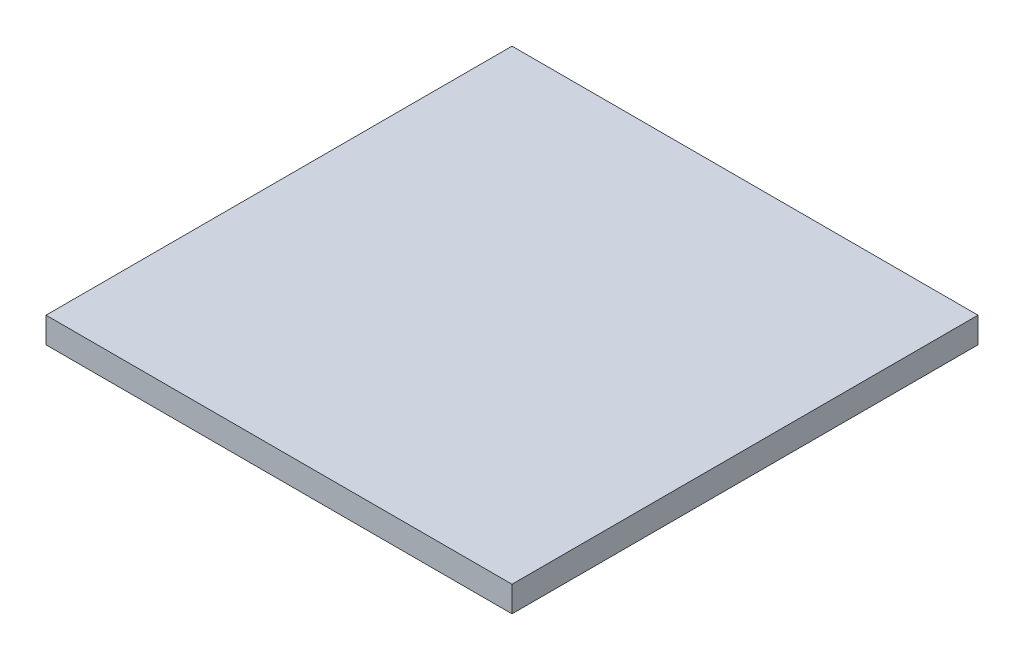
ISO-10303-21;
HEADER;
FILE_DESCRIPTION(('STEP AP214'),'2;1');
FILE_NAME('part.step','',(''),(''),'','','');
FILE_SCHEMA(('AUTOMOTIVE_DESIGN { 1 0 10303 214 1 1 1 1 }'));
ENDSEC;
DATA;
#1=APPLICATION_CONTEXT('core data for automotive mechanical design processes');
#2=APPLICATION_PROTOCOL_DEFINITION('international standard','automotive_design',2000,#1);
#3=PRODUCT_CONTEXT('',#1,'mechanical');
#4=PRODUCT('Part','Part','',(#3));
#5=PRODUCT_RELATED_PRODUCT_CATEGORY('part','',(#4));
#6=PRODUCT_DEFINITION_FORMATION('','',#4);
#7=PRODUCT_DEFINITION_CONTEXT('part definition',#1,'design');
#8=PRODUCT_DEFINITION('design','',#6,#7);
#9=PRODUCT_DEFINITION_SHAPE('','',#8);
#10=(LENGTH_UNIT() NAMED_UNIT(*) SI_UNIT(.MILLI.,.METRE.));
#11=(NAMED_UNIT(*) PLANE_ANGLE_UNIT() SI_UNIT($,.RADIAN.));
#12=(NAMED_UNIT(*) SI_UNIT($,.STERADIAN.) SOLID_ANGLE_UNIT());
#13=UNCERTAINTY_MEASURE_WITH_UNIT(LENGTH_MEASURE(1.E-05),#10,'distance_accuracy_value','');
#14=(GEOMETRIC_REPRESENTATION_CONTEXT(3) GLOBAL_UNCERTAINTY_ASSIGNED_CONTEXT((#13)) GLOBAL_UNIT_ASSIGNED_CONTEXT((#10,
#11,#12)) REPRESENTATION_CONTEXT('',''));
#15=CARTESIAN_POINT('',(0.,0.,0.));
#16=DIRECTION('',(0.,0.,1.));
#17=DIRECTION('',(1.,0.,0.));
#18=AXIS2_PLACEMENT_3D('',#15,#16,#17);
#19=CARTESIAN_POINT('',(25.4,2.8,-25.4));
#20=DIRECTION('',(-1.,0.,0.));
#21=DIRECTION('',(0.,0.,1.));
#22=AXIS2_PLACEMENT_3D('',#19,#20,#21);
#23=PLANE('',#22);
#24=DIRECTION('',(0.,0.,-1.));
#25=VECTOR('',#24,1.);
#26=CARTESIAN_POINT('',(25.4,0.,-25.4));
#27=LINE('',#26,#25);
#28=CARTESIAN_POINT('',(25.4,0.,25.4));
#29=VERTEX_POINT('',#28);
#30=CARTESIAN_POINT('',(25.4,0.,-25.4));
#31=VERTEX_POINT('',#30);
#32=EDGE_CURVE('E111',#29,#31,#27,.T.);
#33=ORIENTED_EDGE('',*,*,#32,.T.);
#34=DIRECTION('',(0.,-1.,0.));
#35=VECTOR('',#34,1.);
#36=CARTESIAN_POINT('',(25.4,2.8,-25.4));
#37=LINE('',#36,#35);
#38=CARTESIAN_POINT('',(25.4,2.8,-25.4));
#39=VERTEX_POINT('',#38);
#40=EDGE_CURVE('E11',#39,#31,#37,.T.);
#41=ORIENTED_EDGE('',*,*,#40,.F.);
#42=DIRECTION('',(0.,0.,-1.));
#43=VECTOR('',#42,1.);
#44=CARTESIAN_POINT('',(25.4,2.8,-25.4));
#45=LINE('',#44,#43);
#46=CARTESIAN_POINT('',(25.4,2.8,25.4));
#47=VERTEX_POINT('',#46);
#48=EDGE_CURVE('E95',#47,#39,#45,.T.);
#49=ORIENTED_EDGE('',*,*,#48,.F.);
#50=DIRECTION('',(0.,-1.,0.));
#51=VECTOR('',#50,1.);
#52=CARTESIAN_POINT('',(25.4,2.8,25.4));
#53=LINE('',#52,#51);
#54=EDGE_CURVE('E107',#47,#29,#53,.T.);
#55=ORIENTED_EDGE('',*,*,#54,.T.);
#56=EDGE_LOOP('',(#33,#41,#49,#55));
#57=FACE_BOUND('',#56,.T.);
#58=ADVANCED_FACE('F43',(#57),#23,.F.);
#59=CARTESIAN_POINT('',(-25.4,2.8,-25.4));
#60=DIRECTION('',(0.,0.,1.));
#61=DIRECTION('',(1.,0.,0.));
#62=AXIS2_PLACEMENT_3D('',#59,#60,#61);
#63=PLANE('',#62);
#64=DIRECTION('',(-1.,0.,0.));
#65=VECTOR('',#64,1.);
#66=CARTESIAN_POINT('',(-25.4,0.,-25.4));
#67=LINE('',#66,#65);
#68=CARTESIAN_POINT('',(-25.4,0.,-25.4));
#69=VERTEX_POINT('',#68);
#70=EDGE_CURVE('E100',#31,#69,#67,.T.);
#71=ORIENTED_EDGE('',*,*,#70,.T.);
#72=DIRECTION('',(0.,-1.,0.));
#73=VECTOR('',#72,1.);
#74=CARTESIAN_POINT('',(-25.4,2.8,-25.4));
#75=LINE('',#74,#73);
#76=CARTESIAN_POINT('',(-25.4,2.8,-25.4));
#77=VERTEX_POINT('',#76);
#78=EDGE_CURVE('E52',#77,#69,#75,.T.);
#79=ORIENTED_EDGE('',*,*,#78,.F.);
#80=DIRECTION('',(-1.,0.,0.));
#81=VECTOR('',#80,1.);
#82=CARTESIAN_POINT('',(-25.4,2.8,-25.4));
#83=LINE('',#82,#81);
#84=EDGE_CURVE('E90',#39,#77,#83,.T.);
#85=ORIENTED_EDGE('',*,*,#84,.F.);
#86=ORIENTED_EDGE('',*,*,#40,.T.);
#87=EDGE_LOOP('',(#71,#79,#85,#86));
#88=FACE_BOUND('',#87,.T.);
#89=ADVANCED_FACE('F99',(#88),#63,.F.);
#90=CARTESIAN_POINT('',(-25.4,2.8,-25.4));
#91=DIRECTION('',(1.,0.,0.));
#92=DIRECTION('',(0.,0.,-1.));
#93=AXIS2_PLACEMENT_3D('',#90,#91,#92);
#94=PLANE('',#93);
#95=DIRECTION('',(0.,0.,1.));
#96=VECTOR('',#95,1.);
#97=CARTESIAN_POINT('',(-25.4,0.,-25.4));
#98=LINE('',#97,#96);
#99=CARTESIAN_POINT('',(-25.4,0.,25.4));
#100=VERTEX_POINT('',#99);
#101=EDGE_CURVE('E77',#69,#100,#98,.T.);
#102=ORIENTED_EDGE('',*,*,#101,.T.);
#103=DIRECTION('',(0.,-1.,0.));
#104=VECTOR('',#103,1.);
#105=CARTESIAN_POINT('',(-25.4,2.8,25.4));
#106=LINE('',#105,#104);
#107=CARTESIAN_POINT('',(-25.4,2.8,25.4));
#108=VERTEX_POINT('',#107);
#109=EDGE_CURVE('E102',#108,#100,#106,.T.);
#110=ORIENTED_EDGE('',*,*,#109,.F.);
#111=DIRECTION('',(0.,0.,1.));
#112=VECTOR('',#111,1.);
#113=CARTESIAN_POINT('',(-25.4,2.8,-25.4));
#114=LINE('',#113,#112);
#115=EDGE_CURVE('E93',#77,#108,#114,.T.);
#116=ORIENTED_EDGE('',*,*,#115,.F.);
#117=ORIENTED_EDGE('',*,*,#78,.T.);
#118=EDGE_LOOP('',(#102,#110,#116,#117));
#119=FACE_BOUND('',#118,.T.);
#120=ADVANCED_FACE('F103',(#119),#94,.F.);
#121=CARTESIAN_POINT('',(-25.4,2.8,25.4));
#122=DIRECTION('',(0.,0.,-1.));
#123=DIRECTION('',(-1.,0.,0.));
#124=AXIS2_PLACEMENT_3D('',#121,#122,#123);
#125=PLANE('',#124);
#126=DIRECTION('',(1.,0.,0.));
#127=VECTOR('',#126,1.);
#128=CARTESIAN_POINT('',(-25.4,0.,25.4));
#129=LINE('',#128,#127);
#130=EDGE_CURVE('E83',#100,#29,#129,.T.);
#131=ORIENTED_EDGE('',*,*,#130,.T.);
#132=ORIENTED_EDGE('',*,*,#54,.F.);
#133=DIRECTION('',(1.,0.,0.));
#134=VECTOR('',#133,1.);
#135=CARTESIAN_POINT('',(-25.4,2.8,25.4));
#136=LINE('',#135,#134);
#137=EDGE_CURVE('E60',#108,#47,#136,.T.);
#138=ORIENTED_EDGE('',*,*,#137,.F.);
#139=ORIENTED_EDGE('',*,*,#109,.T.);
#140=EDGE_LOOP('',(#131,#132,#138,#139));
#141=FACE_BOUND('',#140,.T.);
#142=ADVANCED_FACE('F124',(#141),#125,.F.);
#143=CARTESIAN_POINT('',(0.,2.8,0.));
#144=DIRECTION('',(0.,1.,0.));
#145=DIRECTION('',(0.,0.,1.));
#146=AXIS2_PLACEMENT_3D('',#143,#144,#145);
#147=PLANE('',#146);
#148=ORIENTED_EDGE('',*,*,#48,.T.);
#149=ORIENTED_EDGE('',*,*,#84,.T.);
#150=ORIENTED_EDGE('',*,*,#115,.T.);
#151=ORIENTED_EDGE('',*,*,#137,.T.);
#152=EDGE_LOOP('',(#148,#149,#150,#151));
#153=FACE_BOUND('',#152,.T.);
#154=ADVANCED_FACE('F91',(#153),#147,.T.);
#155=CARTESIAN_POINT('',(0.,0.,0.));
#156=DIRECTION('',(0.,1.,0.));
#157=DIRECTION('',(0.,0.,1.));
#158=AXIS2_PLACEMENT_3D('',#155,#156,#157);
#159=PLANE('',#158);
#160=ORIENTED_EDGE('',*,*,#32,.F.);
#161=ORIENTED_EDGE('',*,*,#130,.F.);
#162=ORIENTED_EDGE('',*,*,#101,.F.);
#163=ORIENTED_EDGE('',*,*,#70,.F.);
#164=EDGE_LOOP('',(#160,#161,#162,#163));
#165=FACE_BOUND('',#164,.T.);
#166=ADVANCED_FACE('F127',(#165),#159,.F.);
#167=CLOSED_SHELL('',(#58,#89,#120,#142,#154,#166));
#168=MANIFOLD_SOLID_BREP('B2',#167);
#169=ADVANCED_BREP_SHAPE_REPRESENTATION('',(#18,#168),#14);
#170=SHAPE_DEFINITION_REPRESENTATION(#9,#169);
ENDSEC;
END-ISO-10303-21;
